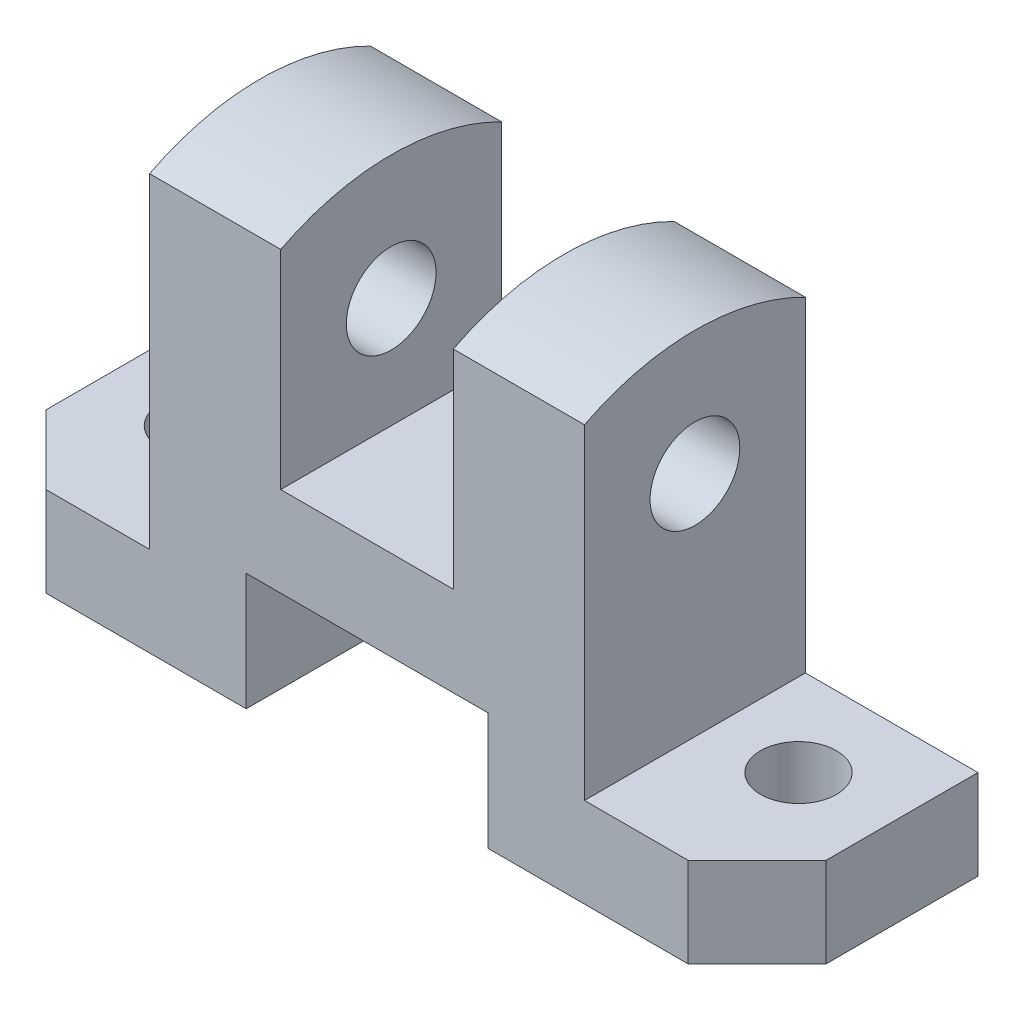
ISO-10303-21;
HEADER;
FILE_DESCRIPTION(('STEP AP214'),'2;1');
FILE_NAME('part.step','',(''),(''),'','','');
FILE_SCHEMA(('AUTOMOTIVE_DESIGN { 1 0 10303 214 1 1 1 1 }'));
ENDSEC;
DATA;
#1=APPLICATION_CONTEXT('core data for automotive mechanical design processes');
#2=APPLICATION_PROTOCOL_DEFINITION('international standard','automotive_design',2000,#1);
#3=PRODUCT_CONTEXT('',#1,'mechanical');
#4=PRODUCT('Part','Part','',(#3));
#5=PRODUCT_RELATED_PRODUCT_CATEGORY('part','',(#4));
#6=PRODUCT_DEFINITION_FORMATION('','',#4);
#7=PRODUCT_DEFINITION_CONTEXT('part definition',#1,'design');
#8=PRODUCT_DEFINITION('design','',#6,#7);
#9=PRODUCT_DEFINITION_SHAPE('','',#8);
#10=(LENGTH_UNIT() NAMED_UNIT(*) SI_UNIT(.MILLI.,.METRE.));
#11=(NAMED_UNIT(*) PLANE_ANGLE_UNIT() SI_UNIT($,.RADIAN.));
#12=(NAMED_UNIT(*) SI_UNIT($,.STERADIAN.) SOLID_ANGLE_UNIT());
#13=UNCERTAINTY_MEASURE_WITH_UNIT(LENGTH_MEASURE(1.E-05),#10,'distance_accuracy_value','');
#14=(GEOMETRIC_REPRESENTATION_CONTEXT(3) GLOBAL_UNCERTAINTY_ASSIGNED_CONTEXT((#13)) GLOBAL_UNIT_ASSIGNED_CONTEXT((#10,
#11,#12)) REPRESENTATION_CONTEXT('',''));
#15=CARTESIAN_POINT('',(0.,0.,0.));
#16=DIRECTION('',(0.,0.,1.));
#17=DIRECTION('',(1.,0.,0.));
#18=AXIS2_PLACEMENT_3D('',#15,#16,#17);
#19=CARTESIAN_POINT('',(-31.5,29.,16.));
#20=DIRECTION('',(1.,0.,0.));
#21=DIRECTION('',(0.,0.,-1.));
#22=AXIS2_PLACEMENT_3D('',#19,#20,#21);
#23=CYLINDRICAL_SURFACE('',#22,35.);
#24=CARTESIAN_POINT('',(-12.5,29.,16.));
#25=DIRECTION('',(-1.,0.,0.));
#26=DIRECTION('',(0.,-1.,0.));
#27=AXIS2_PLACEMENT_3D('',#24,#25,#26);
#28=CIRCLE('',#27,35.);
#29=CARTESIAN_POINT('',(-12.5,60.1287648325468,0.));
#30=VERTEX_POINT('',#29);
#31=CARTESIAN_POINT('',(-12.5,60.1287648325468,32.));
#32=VERTEX_POINT('',#31);
#33=EDGE_CURVE('E180',#30,#32,#28,.F.);
#34=ORIENTED_EDGE('',*,*,#33,.F.);
#35=DIRECTION('',(1.,0.,0.));
#36=VECTOR('',#35,1.);
#37=CARTESIAN_POINT('',(-31.5,60.1287648325468,0.));
#38=LINE('',#37,#36);
#39=CARTESIAN_POINT('',(-31.5,60.1287648325468,0.));
#40=VERTEX_POINT('',#39);
#41=EDGE_CURVE('E231',#40,#30,#38,.T.);
#42=ORIENTED_EDGE('',*,*,#41,.F.);
#43=CARTESIAN_POINT('',(-31.5,29.,16.));
#44=DIRECTION('',(1.,0.,0.));
#45=DIRECTION('',(0.,0.,-1.));
#46=AXIS2_PLACEMENT_3D('',#43,#44,#45);
#47=CIRCLE('',#46,35.);
#48=CARTESIAN_POINT('',(-31.5,60.1287648325468,32.));
#49=VERTEX_POINT('',#48);
#50=EDGE_CURVE('E221',#40,#49,#47,.T.);
#51=ORIENTED_EDGE('',*,*,#50,.T.);
#52=DIRECTION('',(1.,0.,0.));
#53=VECTOR('',#52,1.);
#54=CARTESIAN_POINT('',(-31.5,60.1287648325468,32.));
#55=LINE('',#54,#53);
#56=EDGE_CURVE('E226',#49,#32,#55,.T.);
#57=ORIENTED_EDGE('',*,*,#56,.T.);
#58=EDGE_LOOP('',(#34,#42,#51,#57));
#59=FACE_BOUND('',#58,.T.);
#60=ADVANCED_FACE('F39',(#59),#23,.T.);
#61=CARTESIAN_POINT('',(-31.5,46.,16.));
#62=DIRECTION('',(1.,0.,0.));
#63=DIRECTION('',(0.,0.,-1.));
#64=AXIS2_PLACEMENT_3D('',#61,#62,#63);
#65=CYLINDRICAL_SURFACE('',#64,6.5);
#66=CARTESIAN_POINT('',(-12.5,46.,16.));
#67=DIRECTION('',(-1.,0.,0.));
#68=DIRECTION('',(0.,-1.,0.));
#69=AXIS2_PLACEMENT_3D('',#66,#67,#68);
#70=CIRCLE('',#69,6.5);
#71=CARTESIAN_POINT('',(-12.5,39.5,16.));
#72=VERTEX_POINT('',#71);
#73=EDGE_CURVE('E203',#72,#72,#70,.F.);
#74=ORIENTED_EDGE('',*,*,#73,.T.);
#75=EDGE_LOOP('',(#74));
#76=FACE_BOUND('',#75,.T.);
#77=CARTESIAN_POINT('',(-31.5,46.,16.));
#78=DIRECTION('',(1.,0.,0.));
#79=DIRECTION('',(0.,0.,-1.));
#80=AXIS2_PLACEMENT_3D('',#77,#78,#79);
#81=CIRCLE('',#80,6.5);
#82=CARTESIAN_POINT('',(-31.5,46.,9.5));
#83=VERTEX_POINT('',#82);
#84=EDGE_CURVE('E217',#83,#83,#81,.T.);
#85=ORIENTED_EDGE('',*,*,#84,.F.);
#86=EDGE_LOOP('',(#85));
#87=FACE_BOUND('',#86,.T.);
#88=ADVANCED_FACE('F390',(#76,#87),#65,.F.);
#89=CARTESIAN_POINT('',(0.,13.,0.));
#90=DIRECTION('',(0.,-1.,0.));
#91=DIRECTION('',(0.,0.,-1.));
#92=AXIS2_PLACEMENT_3D('',#89,#90,#91);
#93=PLANE('',#92);
#94=CARTESIAN_POINT('',(43.5,13.,13.));
#95=DIRECTION('',(0.,1.,0.));
#96=DIRECTION('',(0.,0.,1.));
#97=AXIS2_PLACEMENT_3D('',#94,#95,#96);
#98=CIRCLE('',#97,5.5);
#99=CARTESIAN_POINT('',(43.5,13.,7.5));
#100=VERTEX_POINT('',#99);
#101=EDGE_CURVE('E330',#100,#100,#98,.T.);
#102=ORIENTED_EDGE('',*,*,#101,.F.);
#103=EDGE_LOOP('',(#102));
#104=FACE_BOUND('',#103,.T.);
#105=DIRECTION('',(0.,0.,-1.));
#106=VECTOR('',#105,1.);
#107=CARTESIAN_POINT('',(31.5,13.,32.));
#108=LINE('',#107,#106);
#109=CARTESIAN_POINT('',(31.5,13.,32.));
#110=VERTEX_POINT('',#109);
#111=CARTESIAN_POINT('',(31.5,13.,0.));
#112=VERTEX_POINT('',#111);
#113=EDGE_CURVE('E63',#110,#112,#108,.T.);
#114=ORIENTED_EDGE('',*,*,#113,.F.);
#115=DIRECTION('',(1.,0.,0.));
#116=VECTOR('',#115,1.);
#117=CARTESIAN_POINT('',(46.5,13.,32.));
#118=LINE('',#117,#116);
#119=CARTESIAN_POINT('',(46.5,13.,32.));
#120=VERTEX_POINT('',#119);
#121=EDGE_CURVE('E338',#110,#120,#118,.T.);
#122=ORIENTED_EDGE('',*,*,#121,.T.);
#123=DIRECTION('',(0.707106781186546,0.,-0.707106781186549));
#124=VECTOR('',#123,1.);
#125=CARTESIAN_POINT('',(56.5,13.,22.));
#126=LINE('',#125,#124);
#127=CARTESIAN_POINT('',(56.5,13.,22.));
#128=VERTEX_POINT('',#127);
#129=EDGE_CURVE('E341',#120,#128,#126,.T.);
#130=ORIENTED_EDGE('',*,*,#129,.T.);
#131=DIRECTION('',(0.,0.,-1.));
#132=VECTOR('',#131,1.);
#133=CARTESIAN_POINT('',(56.5,13.,0.));
#134=LINE('',#133,#132);
#135=CARTESIAN_POINT('',(56.5,13.,0.));
#136=VERTEX_POINT('',#135);
#137=EDGE_CURVE('E345',#128,#136,#134,.T.);
#138=ORIENTED_EDGE('',*,*,#137,.T.);
#139=DIRECTION('',(-1.,0.,0.));
#140=VECTOR('',#139,1.);
#141=CARTESIAN_POINT('',(17.5,13.,0.));
#142=LINE('',#141,#140);
#143=EDGE_CURVE('E348',#136,#112,#142,.T.);
#144=ORIENTED_EDGE('',*,*,#143,.T.);
#145=EDGE_LOOP('',(#114,#122,#130,#138,#144));
#146=FACE_BOUND('',#145,.T.);
#147=ADVANCED_FACE('F412',(#104,#146),#93,.F.);
#148=CARTESIAN_POINT('',(0.,0.,0.));
#149=DIRECTION('',(0.,-1.,0.));
#150=DIRECTION('',(0.,0.,-1.));
#151=AXIS2_PLACEMENT_3D('',#148,#149,#150);
#152=PLANE('',#151);
#153=DIRECTION('',(0.,0.,1.));
#154=VECTOR('',#153,1.);
#155=CARTESIAN_POINT('',(17.5,0.,0.));
#156=LINE('',#155,#154);
#157=CARTESIAN_POINT('',(17.5,0.,0.));
#158=VERTEX_POINT('',#157);
#159=CARTESIAN_POINT('',(17.5,0.,32.));
#160=VERTEX_POINT('',#159);
#161=EDGE_CURVE('E334',#158,#160,#156,.T.);
#162=ORIENTED_EDGE('',*,*,#161,.F.);
#163=DIRECTION('',(-1.,0.,0.));
#164=VECTOR('',#163,1.);
#165=CARTESIAN_POINT('',(17.5,0.,0.));
#166=LINE('',#165,#164);
#167=CARTESIAN_POINT('',(56.5,0.,0.));
#168=VERTEX_POINT('',#167);
#169=EDGE_CURVE('E342',#168,#158,#166,.T.);
#170=ORIENTED_EDGE('',*,*,#169,.F.);
#171=DIRECTION('',(0.,0.,-1.));
#172=VECTOR('',#171,1.);
#173=CARTESIAN_POINT('',(56.5,0.,0.));
#174=LINE('',#173,#172);
#175=CARTESIAN_POINT('',(56.5,0.,22.));
#176=VERTEX_POINT('',#175);
#177=EDGE_CURVE('E361',#176,#168,#174,.T.);
#178=ORIENTED_EDGE('',*,*,#177,.F.);
#179=DIRECTION('',(0.707106781186546,0.,-0.707106781186549));
#180=VECTOR('',#179,1.);
#181=CARTESIAN_POINT('',(56.5,0.,22.));
#182=LINE('',#181,#180);
#183=CARTESIAN_POINT('',(46.5,0.,32.));
#184=VERTEX_POINT('',#183);
#185=EDGE_CURVE('E358',#184,#176,#182,.T.);
#186=ORIENTED_EDGE('',*,*,#185,.F.);
#187=DIRECTION('',(1.,0.,0.));
#188=VECTOR('',#187,1.);
#189=CARTESIAN_POINT('',(46.5,0.,32.));
#190=LINE('',#189,#188);
#191=EDGE_CURVE('E355',#160,#184,#190,.T.);
#192=ORIENTED_EDGE('',*,*,#191,.F.);
#193=EDGE_LOOP('',(#162,#170,#178,#186,#192));
#194=FACE_BOUND('',#193,.T.);
#195=CARTESIAN_POINT('',(43.5,0.,13.));
#196=DIRECTION('',(0.,1.,0.));
#197=DIRECTION('',(0.,0.,1.));
#198=AXIS2_PLACEMENT_3D('',#195,#196,#197);
#199=CIRCLE('',#198,5.5);
#200=CARTESIAN_POINT('',(43.5,0.,7.5));
#201=VERTEX_POINT('',#200);
#202=EDGE_CURVE('E329',#201,#201,#199,.T.);
#203=ORIENTED_EDGE('',*,*,#202,.T.);
#204=EDGE_LOOP('',(#203));
#205=FACE_BOUND('',#204,.T.);
#206=ADVANCED_FACE('F448',(#194,#205),#152,.T.);
#207=CARTESIAN_POINT('',(17.5,13.,0.));
#208=DIRECTION('',(1.,0.,0.));
#209=DIRECTION('',(0.,0.,-1.));
#210=AXIS2_PLACEMENT_3D('',#207,#208,#209);
#211=PLANE('',#210);
#212=ORIENTED_EDGE('',*,*,#161,.T.);
#213=DIRECTION('',(0.,-1.,0.));
#214=VECTOR('',#213,1.);
#215=CARTESIAN_POINT('',(17.5,13.,32.));
#216=LINE('',#215,#214);
#217=CARTESIAN_POINT('',(17.5,17.,32.));
#218=VERTEX_POINT('',#217);
#219=EDGE_CURVE('E48',#218,#160,#216,.T.);
#220=ORIENTED_EDGE('',*,*,#219,.F.);
#221=DIRECTION('',(0.,0.,-1.));
#222=VECTOR('',#221,1.);
#223=CARTESIAN_POINT('',(17.5,17.,32.));
#224=LINE('',#223,#222);
#225=CARTESIAN_POINT('',(17.5,17.,0.));
#226=VERTEX_POINT('',#225);
#227=EDGE_CURVE('E321',#218,#226,#224,.T.);
#228=ORIENTED_EDGE('',*,*,#227,.T.);
#229=DIRECTION('',(0.,-1.,0.));
#230=VECTOR('',#229,1.);
#231=CARTESIAN_POINT('',(17.5,13.,0.));
#232=LINE('',#231,#230);
#233=EDGE_CURVE('E351',#226,#158,#232,.T.);
#234=ORIENTED_EDGE('',*,*,#233,.T.);
#235=EDGE_LOOP('',(#212,#220,#228,#234));
#236=FACE_BOUND('',#235,.T.);
#237=ADVANCED_FACE('F41',(#236),#211,.F.);
#238=CARTESIAN_POINT('',(46.5,13.,32.));
#239=DIRECTION('',(0.,0.,-1.));
#240=DIRECTION('',(-1.,0.,0.));
#241=AXIS2_PLACEMENT_3D('',#238,#239,#240);
#242=PLANE('',#241);
#243=DIRECTION('',(1.,0.,0.));
#244=VECTOR('',#243,1.);
#245=CARTESIAN_POINT('',(-12.5,30.,32.));
#246=LINE('',#245,#244);
#247=CARTESIAN_POINT('',(-12.5,30.,32.));
#248=VERTEX_POINT('',#247);
#249=CARTESIAN_POINT('',(12.5,30.,32.));
#250=VERTEX_POINT('',#249);
#251=EDGE_CURVE('E170',#248,#250,#246,.T.);
#252=ORIENTED_EDGE('',*,*,#251,.F.);
#253=DIRECTION('',(0.,-1.,0.));
#254=VECTOR('',#253,1.);
#255=CARTESIAN_POINT('',(-12.5,64.,32.));
#256=LINE('',#255,#254);
#257=EDGE_CURVE('E178',#32,#248,#256,.T.);
#258=ORIENTED_EDGE('',*,*,#257,.F.);
#259=ORIENTED_EDGE('',*,*,#56,.F.);
#260=DIRECTION('',(0.,-1.,0.));
#261=VECTOR('',#260,1.);
#262=CARTESIAN_POINT('',(-31.5,13.,32.));
#263=LINE('',#262,#261);
#264=CARTESIAN_POINT('',(-31.5,13.,32.));
#265=VERTEX_POINT('',#264);
#266=EDGE_CURVE('E298',#49,#265,#263,.T.);
#267=ORIENTED_EDGE('',*,*,#266,.T.);
#268=DIRECTION('',(1.,0.,0.));
#269=VECTOR('',#268,1.);
#270=CARTESIAN_POINT('',(-46.5,13.,32.));
#271=LINE('',#270,#269);
#272=CARTESIAN_POINT('',(-46.5,13.,32.));
#273=VERTEX_POINT('',#272);
#274=EDGE_CURVE('E253',#273,#265,#271,.T.);
#275=ORIENTED_EDGE('',*,*,#274,.F.);
#276=DIRECTION('',(0.,-1.,0.));
#277=VECTOR('',#276,1.);
#278=CARTESIAN_POINT('',(-46.5,13.,32.));
#279=LINE('',#278,#277);
#280=CARTESIAN_POINT('',(-46.5,0.,32.));
#281=VERTEX_POINT('',#280);
#282=EDGE_CURVE('E256',#273,#281,#279,.T.);
#283=ORIENTED_EDGE('',*,*,#282,.T.);
#284=DIRECTION('',(1.,0.,0.));
#285=VECTOR('',#284,1.);
#286=CARTESIAN_POINT('',(-46.5,0.,32.));
#287=LINE('',#286,#285);
#288=CARTESIAN_POINT('',(-17.5,0.,32.));
#289=VERTEX_POINT('',#288);
#290=EDGE_CURVE('E266',#281,#289,#287,.T.);
#291=ORIENTED_EDGE('',*,*,#290,.T.);
#292=DIRECTION('',(0.,1.,0.));
#293=VECTOR('',#292,1.);
#294=CARTESIAN_POINT('',(-17.5,17.,32.));
#295=LINE('',#294,#293);
#296=CARTESIAN_POINT('',(-17.5,17.,32.));
#297=VERTEX_POINT('',#296);
#298=EDGE_CURVE('E285',#289,#297,#295,.T.);
#299=ORIENTED_EDGE('',*,*,#298,.T.);
#300=DIRECTION('',(1.,0.,0.));
#301=VECTOR('',#300,1.);
#302=CARTESIAN_POINT('',(-12.5,17.,32.));
#303=LINE('',#302,#301);
#304=EDGE_CURVE('E289',#297,#218,#303,.T.);
#305=ORIENTED_EDGE('',*,*,#304,.T.);
#306=ORIENTED_EDGE('',*,*,#219,.T.);
#307=ORIENTED_EDGE('',*,*,#191,.T.);
#308=DIRECTION('',(0.,-1.,0.));
#309=VECTOR('',#308,1.);
#310=CARTESIAN_POINT('',(46.5,13.,32.));
#311=LINE('',#310,#309);
#312=EDGE_CURVE('E377',#120,#184,#311,.T.);
#313=ORIENTED_EDGE('',*,*,#312,.F.);
#314=ORIENTED_EDGE('',*,*,#121,.F.);
#315=DIRECTION('',(0.,1.,0.));
#316=VECTOR('',#315,1.);
#317=CARTESIAN_POINT('',(31.5,13.,32.));
#318=LINE('',#317,#316);
#319=CARTESIAN_POINT('',(31.5,60.1287648325468,32.));
#320=VERTEX_POINT('',#319);
#321=EDGE_CURVE('E294',#110,#320,#318,.T.);
#322=ORIENTED_EDGE('',*,*,#321,.T.);
#323=CARTESIAN_POINT('',(12.5,60.1287648325468,32.));
#324=VERTEX_POINT('',#323);
#325=EDGE_CURVE('E230',#324,#320,#55,.T.);
#326=ORIENTED_EDGE('',*,*,#325,.F.);
#327=DIRECTION('',(0.,1.,0.));
#328=VECTOR('',#327,1.);
#329=CARTESIAN_POINT('',(12.5,30.,32.));
#330=LINE('',#329,#328);
#331=EDGE_CURVE('E55',#250,#324,#330,.T.);
#332=ORIENTED_EDGE('',*,*,#331,.F.);
#333=EDGE_LOOP('',(#252,#258,#259,#267,#275,#283,#291,#299,#305,#306,#307,#313,#314,#322,#326,#332));
#334=FACE_BOUND('',#333,.T.);
#335=ADVANCED_FACE('F186',(#334),#242,.F.);
#336=CARTESIAN_POINT('',(56.5,13.,22.));
#337=DIRECTION('',(-0.707106781186549,0.,-0.707106781186546));
#338=DIRECTION('',(-0.707106781186546,0.,0.707106781186549));
#339=AXIS2_PLACEMENT_3D('',#336,#337,#338);
#340=PLANE('',#339);
#341=ORIENTED_EDGE('',*,*,#185,.T.);
#342=DIRECTION('',(0.,-1.,0.));
#343=VECTOR('',#342,1.);
#344=CARTESIAN_POINT('',(56.5,13.,22.));
#345=LINE('',#344,#343);
#346=EDGE_CURVE('E373',#128,#176,#345,.T.);
#347=ORIENTED_EDGE('',*,*,#346,.F.);
#348=ORIENTED_EDGE('',*,*,#129,.F.);
#349=ORIENTED_EDGE('',*,*,#312,.T.);
#350=EDGE_LOOP('',(#341,#347,#348,#349));
#351=FACE_BOUND('',#350,.T.);
#352=ADVANCED_FACE('F512',(#351),#340,.F.);
#353=CARTESIAN_POINT('',(56.5,13.,0.));
#354=DIRECTION('',(-1.,0.,0.));
#355=DIRECTION('',(0.,0.,1.));
#356=AXIS2_PLACEMENT_3D('',#353,#354,#355);
#357=PLANE('',#356);
#358=ORIENTED_EDGE('',*,*,#177,.T.);
#359=DIRECTION('',(0.,-1.,0.));
#360=VECTOR('',#359,1.);
#361=CARTESIAN_POINT('',(56.5,13.,0.));
#362=LINE('',#361,#360);
#363=EDGE_CURVE('E369',#136,#168,#362,.T.);
#364=ORIENTED_EDGE('',*,*,#363,.F.);
#365=ORIENTED_EDGE('',*,*,#137,.F.);
#366=ORIENTED_EDGE('',*,*,#346,.T.);
#367=EDGE_LOOP('',(#358,#364,#365,#366));
#368=FACE_BOUND('',#367,.T.);
#369=ADVANCED_FACE('F443',(#368),#357,.F.);
#370=CARTESIAN_POINT('',(17.5,13.,0.));
#371=DIRECTION('',(0.,0.,1.));
#372=DIRECTION('',(1.,0.,0.));
#373=AXIS2_PLACEMENT_3D('',#370,#371,#372);
#374=PLANE('',#373);
#375=ORIENTED_EDGE('',*,*,#41,.T.);
#376=DIRECTION('',(0.,-1.,0.));
#377=VECTOR('',#376,1.);
#378=CARTESIAN_POINT('',(-12.5,13.,0.));
#379=LINE('',#378,#377);
#380=CARTESIAN_POINT('',(-12.5,30.,0.));
#381=VERTEX_POINT('',#380);
#382=EDGE_CURVE('E206',#30,#381,#379,.T.);
#383=ORIENTED_EDGE('',*,*,#382,.T.);
#384=DIRECTION('',(1.,0.,0.));
#385=VECTOR('',#384,1.);
#386=CARTESIAN_POINT('',(17.5,30.,0.));
#387=LINE('',#386,#385);
#388=CARTESIAN_POINT('',(12.5,30.,0.));
#389=VERTEX_POINT('',#388);
#390=EDGE_CURVE('E11',#381,#389,#387,.T.);
#391=ORIENTED_EDGE('',*,*,#390,.T.);
#392=DIRECTION('',(0.,1.,0.));
#393=VECTOR('',#392,1.);
#394=CARTESIAN_POINT('',(12.5,13.,0.));
#395=LINE('',#394,#393);
#396=CARTESIAN_POINT('',(12.5,60.1287648325468,0.));
#397=VERTEX_POINT('',#396);
#398=EDGE_CURVE('E199',#389,#397,#395,.T.);
#399=ORIENTED_EDGE('',*,*,#398,.T.);
#400=CARTESIAN_POINT('',(31.5,60.1287648325468,0.));
#401=VERTEX_POINT('',#400);
#402=EDGE_CURVE('E225',#397,#401,#38,.T.);
#403=ORIENTED_EDGE('',*,*,#402,.T.);
#404=DIRECTION('',(0.,1.,0.));
#405=VECTOR('',#404,1.);
#406=CARTESIAN_POINT('',(31.5,13.,0.));
#407=LINE('',#406,#405);
#408=EDGE_CURVE('E310',#112,#401,#407,.T.);
#409=ORIENTED_EDGE('',*,*,#408,.F.);
#410=ORIENTED_EDGE('',*,*,#143,.F.);
#411=ORIENTED_EDGE('',*,*,#363,.T.);
#412=ORIENTED_EDGE('',*,*,#169,.T.);
#413=ORIENTED_EDGE('',*,*,#233,.F.);
#414=DIRECTION('',(1.,0.,0.));
#415=VECTOR('',#414,1.);
#416=CARTESIAN_POINT('',(12.5,17.,0.));
#417=LINE('',#416,#415);
#418=CARTESIAN_POINT('',(-17.5,17.,0.));
#419=VERTEX_POINT('',#418);
#420=EDGE_CURVE('E306',#419,#226,#417,.T.);
#421=ORIENTED_EDGE('',*,*,#420,.F.);
#422=DIRECTION('',(0.,1.,0.));
#423=VECTOR('',#422,1.);
#424=CARTESIAN_POINT('',(-17.5,17.,0.));
#425=LINE('',#424,#423);
#426=CARTESIAN_POINT('',(-17.5,0.,0.));
#427=VERTEX_POINT('',#426);
#428=EDGE_CURVE('E284',#427,#419,#425,.T.);
#429=ORIENTED_EDGE('',*,*,#428,.F.);
#430=DIRECTION('',(-1.,0.,0.));
#431=VECTOR('',#430,1.);
#432=CARTESIAN_POINT('',(-17.5,0.,0.));
#433=LINE('',#432,#431);
#434=CARTESIAN_POINT('',(-56.5,0.,0.));
#435=VERTEX_POINT('',#434);
#436=EDGE_CURVE('E239',#427,#435,#433,.T.);
#437=ORIENTED_EDGE('',*,*,#436,.T.);
#438=DIRECTION('',(0.,-1.,0.));
#439=VECTOR('',#438,1.);
#440=CARTESIAN_POINT('',(-56.5,13.,0.));
#441=LINE('',#440,#439);
#442=CARTESIAN_POINT('',(-56.5,13.,0.));
#443=VERTEX_POINT('',#442);
#444=EDGE_CURVE('E280',#443,#435,#441,.T.);
#445=ORIENTED_EDGE('',*,*,#444,.F.);
#446=DIRECTION('',(-1.,0.,0.));
#447=VECTOR('',#446,1.);
#448=CARTESIAN_POINT('',(-17.5,13.,0.));
#449=LINE('',#448,#447);
#450=CARTESIAN_POINT('',(-31.5,13.,0.));
#451=VERTEX_POINT('',#450);
#452=EDGE_CURVE('E243',#451,#443,#449,.T.);
#453=ORIENTED_EDGE('',*,*,#452,.F.);
#454=DIRECTION('',(0.,-1.,0.));
#455=VECTOR('',#454,1.);
#456=CARTESIAN_POINT('',(-31.5,13.,0.));
#457=LINE('',#456,#455);
#458=EDGE_CURVE('E290',#40,#451,#457,.T.);
#459=ORIENTED_EDGE('',*,*,#458,.F.);
#460=EDGE_LOOP('',(#375,#383,#391,#399,#403,#409,#410,#411,#412,#413,#421,#429,#437,#445,#453,#459));
#461=FACE_BOUND('',#460,.T.);
#462=ADVANCED_FACE('F436',(#461),#374,.F.);
#463=CARTESIAN_POINT('',(43.5,13.,13.));
#464=DIRECTION('',(0.,-1.,0.));
#465=DIRECTION('',(0.,0.,-1.));
#466=AXIS2_PLACEMENT_3D('',#463,#464,#465);
#467=CYLINDRICAL_SURFACE('',#466,5.5);
#468=CARTESIAN_POINT('',(43.5,13.,7.5));
#469=CARTESIAN_POINT('',(43.5,12.8645833333333,7.5));
#470=CARTESIAN_POINT('',(43.5,12.7291666666667,7.5));
#471=CARTESIAN_POINT('',(43.5,12.4583333333333,7.5));
#472=CARTESIAN_POINT('',(43.5,12.3229166666667,7.5));
#473=CARTESIAN_POINT('',(43.5,12.0520833333333,7.5));
#474=CARTESIAN_POINT('',(43.5,11.9166666666667,7.5));
#475=CARTESIAN_POINT('',(43.5,11.6458333333333,7.5));
#476=CARTESIAN_POINT('',(43.5,11.5104166666667,7.5));
#477=CARTESIAN_POINT('',(43.5,11.2395833333333,7.5));
#478=CARTESIAN_POINT('',(43.5,11.1041666666667,7.5));
#479=CARTESIAN_POINT('',(43.5,10.8333333333333,7.5));
#480=CARTESIAN_POINT('',(43.5,10.6979166666667,7.5));
#481=CARTESIAN_POINT('',(43.5,10.4270833333333,7.5));
#482=CARTESIAN_POINT('',(43.5,10.2916666666667,7.5));
#483=CARTESIAN_POINT('',(43.5,10.0208333333333,7.5));
#484=CARTESIAN_POINT('',(43.5,9.88541666666667,7.5));
#485=CARTESIAN_POINT('',(43.5,9.61458333333333,7.5));
#486=CARTESIAN_POINT('',(43.5,9.47916666666667,7.5));
#487=CARTESIAN_POINT('',(43.5,9.20833333333333,7.5));
#488=CARTESIAN_POINT('',(43.5,9.07291666666666,7.5));
#489=CARTESIAN_POINT('',(43.5,8.80208333333333,7.5));
#490=CARTESIAN_POINT('',(43.5,8.66666666666667,7.5));
#491=CARTESIAN_POINT('',(43.5,8.39583333333333,7.5));
#492=CARTESIAN_POINT('',(43.5,8.26041666666667,7.5));
#493=CARTESIAN_POINT('',(43.5,7.98958333333333,7.5));
#494=CARTESIAN_POINT('',(43.5,7.85416666666667,7.5));
#495=CARTESIAN_POINT('',(43.5,7.58333333333333,7.5));
#496=CARTESIAN_POINT('',(43.5,7.44791666666667,7.5));
#497=CARTESIAN_POINT('',(43.5,7.17708333333333,7.5));
#498=CARTESIAN_POINT('',(43.5,7.04166666666667,7.5));
#499=CARTESIAN_POINT('',(43.5,6.77083333333333,7.5));
#500=CARTESIAN_POINT('',(43.5,6.63541666666667,7.5));
#501=CARTESIAN_POINT('',(43.5,6.36458333333333,7.5));
#502=CARTESIAN_POINT('',(43.5,6.22916666666667,7.5));
#503=CARTESIAN_POINT('',(43.5,5.95833333333333,7.5));
#504=CARTESIAN_POINT('',(43.5,5.82291666666667,7.5));
#505=CARTESIAN_POINT('',(43.5,5.55208333333333,7.5));
#506=CARTESIAN_POINT('',(43.5,5.41666666666667,7.5));
#507=CARTESIAN_POINT('',(43.5,5.14583333333333,7.5));
#508=CARTESIAN_POINT('',(43.5,5.01041666666667,7.5));
#509=CARTESIAN_POINT('',(43.5,4.73958333333333,7.5));
#510=CARTESIAN_POINT('',(43.5,4.60416666666667,7.5));
#511=CARTESIAN_POINT('',(43.5,4.33333333333333,7.5));
#512=CARTESIAN_POINT('',(43.5,4.19791666666667,7.5));
#513=CARTESIAN_POINT('',(43.5,3.92708333333333,7.5));
#514=CARTESIAN_POINT('',(43.5,3.79166666666667,7.5));
#515=CARTESIAN_POINT('',(43.5,3.52083333333333,7.5));
#516=CARTESIAN_POINT('',(43.5,3.38541666666667,7.5));
#517=CARTESIAN_POINT('',(43.5,3.11458333333333,7.5));
#518=CARTESIAN_POINT('',(43.5,2.97916666666667,7.5));
#519=CARTESIAN_POINT('',(43.5,2.70833333333333,7.5));
#520=CARTESIAN_POINT('',(43.5,2.57291666666667,7.5));
#521=CARTESIAN_POINT('',(43.5,2.30208333333333,7.5));
#522=CARTESIAN_POINT('',(43.5,2.16666666666667,7.5));
#523=CARTESIAN_POINT('',(43.5,1.89583333333333,7.5));
#524=CARTESIAN_POINT('',(43.5,1.76041666666667,7.5));
#525=CARTESIAN_POINT('',(43.5,1.48958333333333,7.5));
#526=CARTESIAN_POINT('',(43.5,1.35416666666667,7.5));
#527=CARTESIAN_POINT('',(43.5,1.08333333333333,7.5));
#528=CARTESIAN_POINT('',(43.5,0.947916666666667,7.5));
#529=CARTESIAN_POINT('',(43.5,0.677083333333334,7.5));
#530=CARTESIAN_POINT('',(43.5,0.541666666666667,7.5));
#531=CARTESIAN_POINT('',(43.5,0.270833333333334,7.5));
#532=CARTESIAN_POINT('',(43.5,0.135416666666667,7.5));
#533=CARTESIAN_POINT('',(43.5,0.,7.5));
#534=B_SPLINE_CURVE_WITH_KNOTS('',3,(#468,#469,#470,#471,#472,#473,#474,#475,#476,#477,#478,
#479,#480,#481,#482,#483,#484,#485,#486,#487,#488,#489,#490,#491,#492,#493,#494,#495,#496,#497,
#498,#499,#500,#501,#502,#503,#504,#505,#506,#507,#508,#509,#510,#511,#512,#513,#514,#515,#516,
#517,#518,#519,#520,#521,#522,#523,#524,#525,#526,#527,#528,#529,#530,#531,#532,#533),
.UNSPECIFIED.,.F.,.F.,(4,2,2,2,2,2,2,2,2,2,2,2,2,2,2,2,2,2,2,2,2,2,2,2,2,2,2,2,2,2,2,2,4),(0.,
0.40625,0.812500000000001,1.21875,1.625,2.03125,2.4375,2.84375,3.25,3.65625,4.0625,4.46875,
4.875,5.28125,5.6875,6.09375,6.5,6.90625,7.3125,7.71875,8.125,8.53125,8.9375,9.34375,9.75,
10.15625,10.5625,10.96875,11.375,11.78125,12.1875,12.59375,13.),.UNSPECIFIED.);
#535=EDGE_CURVE('BSEAM499',#100,#201,#534,.T.);
#536=ORIENTED_EDGE('',*,*,#101,.T.);
#537=ORIENTED_EDGE('',*,*,#202,.F.);
#538=ORIENTED_EDGE('',*,*,#535,.T.);
#539=ORIENTED_EDGE('',*,*,#535,.F.);
#540=EDGE_LOOP('',(#536,#538,#537,#539));
#541=FACE_BOUND('',#540,.T.);
#542=ADVANCED_FACE('F499',(#541),#467,.F.);
#543=CARTESIAN_POINT('',(-17.5,17.,32.));
#544=DIRECTION('',(-1.,0.,0.));
#545=DIRECTION('',(0.,-1.,0.));
#546=AXIS2_PLACEMENT_3D('',#543,#544,#545);
#547=PLANE('',#546);
#548=ORIENTED_EDGE('',*,*,#428,.T.);
#549=DIRECTION('',(0.,0.,-1.));
#550=VECTOR('',#549,1.);
#551=CARTESIAN_POINT('',(-17.5,17.,32.));
#552=LINE('',#551,#550);
#553=EDGE_CURVE('E325',#297,#419,#552,.T.);
#554=ORIENTED_EDGE('',*,*,#553,.F.);
#555=ORIENTED_EDGE('',*,*,#298,.F.);
#556=DIRECTION('',(0.,0.,-1.));
#557=VECTOR('',#556,1.);
#558=CARTESIAN_POINT('',(-17.5,0.,0.));
#559=LINE('',#558,#557);
#560=EDGE_CURVE('E247',#289,#427,#559,.T.);
#561=ORIENTED_EDGE('',*,*,#560,.T.);
#562=EDGE_LOOP('',(#548,#554,#555,#561));
#563=FACE_BOUND('',#562,.T.);
#564=ADVANCED_FACE('F459',(#563),#547,.F.);
#565=CARTESIAN_POINT('',(12.5,17.,32.));
#566=DIRECTION('',(0.,1.,0.));
#567=DIRECTION('',(0.,0.,1.));
#568=AXIS2_PLACEMENT_3D('',#565,#566,#567);
#569=PLANE('',#568);
#570=ORIENTED_EDGE('',*,*,#420,.T.);
#571=ORIENTED_EDGE('',*,*,#227,.F.);
#572=ORIENTED_EDGE('',*,*,#304,.F.);
#573=ORIENTED_EDGE('',*,*,#553,.T.);
#574=EDGE_LOOP('',(#570,#571,#572,#573));
#575=FACE_BOUND('',#574,.T.);
#576=ADVANCED_FACE('F453',(#575),#569,.F.);
#577=CARTESIAN_POINT('',(31.5,13.,32.));
#578=DIRECTION('',(-1.,0.,0.));
#579=DIRECTION('',(0.,-1.,0.));
#580=AXIS2_PLACEMENT_3D('',#577,#578,#579);
#581=PLANE('',#580);
#582=ORIENTED_EDGE('',*,*,#408,.T.);
#583=CARTESIAN_POINT('',(31.5,29.,16.));
#584=DIRECTION('',(1.,0.,0.));
#585=DIRECTION('',(0.,0.,-1.));
#586=AXIS2_PLACEMENT_3D('',#583,#584,#585);
#587=CIRCLE('',#586,35.);
#588=EDGE_CURVE('E213',#401,#320,#587,.T.);
#589=ORIENTED_EDGE('',*,*,#588,.T.);
#590=ORIENTED_EDGE('',*,*,#321,.F.);
#591=ORIENTED_EDGE('',*,*,#113,.T.);
#592=EDGE_LOOP('',(#582,#589,#590,#591));
#593=FACE_BOUND('',#592,.T.);
#594=CARTESIAN_POINT('',(31.5,46.,16.));
#595=DIRECTION('',(1.,0.,0.));
#596=DIRECTION('',(0.,0.,-1.));
#597=AXIS2_PLACEMENT_3D('',#594,#595,#596);
#598=CIRCLE('',#597,6.5);
#599=CARTESIAN_POINT('',(31.5,46.,9.5));
#600=VERTEX_POINT('',#599);
#601=EDGE_CURVE('E209',#600,#600,#598,.T.);
#602=ORIENTED_EDGE('',*,*,#601,.F.);
#603=EDGE_LOOP('',(#602));
#604=FACE_BOUND('',#603,.T.);
#605=ADVANCED_FACE('F433',(#593,#604),#581,.F.);
#606=CARTESIAN_POINT('',(-31.5,13.,32.));
#607=DIRECTION('',(1.,0.,0.));
#608=DIRECTION('',(0.,1.,0.));
#609=AXIS2_PLACEMENT_3D('',#606,#607,#608);
#610=PLANE('',#609);
#611=ORIENTED_EDGE('',*,*,#458,.T.);
#612=DIRECTION('',(0.,0.,-1.));
#613=VECTOR('',#612,1.);
#614=CARTESIAN_POINT('',(-31.5,13.,32.));
#615=LINE('',#614,#613);
#616=EDGE_CURVE('E302',#265,#451,#615,.T.);
#617=ORIENTED_EDGE('',*,*,#616,.F.);
#618=ORIENTED_EDGE('',*,*,#266,.F.);
#619=ORIENTED_EDGE('',*,*,#50,.F.);
#620=EDGE_LOOP('',(#611,#617,#618,#619));
#621=FACE_BOUND('',#620,.T.);
#622=ORIENTED_EDGE('',*,*,#84,.T.);
#623=EDGE_LOOP('',(#622));
#624=FACE_BOUND('',#623,.T.);
#625=ADVANCED_FACE('F475',(#621,#624),#610,.F.);
#626=CARTESIAN_POINT('',(0.,13.,0.));
#627=DIRECTION('',(0.,1.,0.));
#628=DIRECTION('',(0.,0.,1.));
#629=AXIS2_PLACEMENT_3D('',#626,#627,#628);
#630=PLANE('',#629);
#631=CARTESIAN_POINT('',(-43.5,13.,13.));
#632=DIRECTION('',(0.,1.,0.));
#633=DIRECTION('',(0.,0.,-1.));
#634=AXIS2_PLACEMENT_3D('',#631,#632,#633);
#635=CIRCLE('',#634,5.5);
#636=CARTESIAN_POINT('',(-43.5,13.,7.50000000000001));
#637=VERTEX_POINT('',#636);
#638=EDGE_CURVE('E235',#637,#637,#635,.T.);
#639=ORIENTED_EDGE('',*,*,#638,.F.);
#640=EDGE_LOOP('',(#639));
#641=FACE_BOUND('',#640,.T.);
#642=ORIENTED_EDGE('',*,*,#616,.T.);
#643=ORIENTED_EDGE('',*,*,#452,.T.);
#644=DIRECTION('',(0.,0.,1.));
#645=VECTOR('',#644,1.);
#646=CARTESIAN_POINT('',(-56.5,13.,0.));
#647=LINE('',#646,#645);
#648=CARTESIAN_POINT('',(-56.5,13.,22.));
#649=VERTEX_POINT('',#648);
#650=EDGE_CURVE('E246',#443,#649,#647,.T.);
#651=ORIENTED_EDGE('',*,*,#650,.T.);
#652=DIRECTION('',(0.707106781186546,0.,0.707106781186549));
#653=VECTOR('',#652,1.);
#654=CARTESIAN_POINT('',(-56.5,13.,22.));
#655=LINE('',#654,#653);
#656=EDGE_CURVE('E250',#649,#273,#655,.T.);
#657=ORIENTED_EDGE('',*,*,#656,.T.);
#658=ORIENTED_EDGE('',*,*,#274,.T.);
#659=EDGE_LOOP('',(#642,#643,#651,#657,#658));
#660=FACE_BOUND('',#659,.T.);
#661=ADVANCED_FACE('F479',(#641,#660),#630,.T.);
#662=CARTESIAN_POINT('',(0.,0.,0.));
#663=DIRECTION('',(0.,1.,0.));
#664=DIRECTION('',(0.,0.,1.));
#665=AXIS2_PLACEMENT_3D('',#662,#663,#664);
#666=PLANE('',#665);
#667=ORIENTED_EDGE('',*,*,#436,.F.);
#668=ORIENTED_EDGE('',*,*,#560,.F.);
#669=ORIENTED_EDGE('',*,*,#290,.F.);
#670=DIRECTION('',(0.707106781186546,0.,0.707106781186549));
#671=VECTOR('',#670,1.);
#672=CARTESIAN_POINT('',(-56.5,0.,22.));
#673=LINE('',#672,#671);
#674=CARTESIAN_POINT('',(-56.5,0.,22.));
#675=VERTEX_POINT('',#674);
#676=EDGE_CURVE('E263',#675,#281,#673,.T.);
#677=ORIENTED_EDGE('',*,*,#676,.F.);
#678=DIRECTION('',(0.,0.,1.));
#679=VECTOR('',#678,1.);
#680=CARTESIAN_POINT('',(-56.5,0.,0.));
#681=LINE('',#680,#679);
#682=EDGE_CURVE('E260',#435,#675,#681,.T.);
#683=ORIENTED_EDGE('',*,*,#682,.F.);
#684=EDGE_LOOP('',(#667,#668,#669,#677,#683));
#685=FACE_BOUND('',#684,.T.);
#686=CARTESIAN_POINT('',(-43.5,0.,13.));
#687=DIRECTION('',(0.,1.,0.));
#688=DIRECTION('',(0.,0.,-1.));
#689=AXIS2_PLACEMENT_3D('',#686,#687,#688);
#690=CIRCLE('',#689,5.5);
#691=CARTESIAN_POINT('',(-43.5,0.,7.50000000000001));
#692=VERTEX_POINT('',#691);
#693=EDGE_CURVE('E229',#692,#692,#690,.T.);
#694=ORIENTED_EDGE('',*,*,#693,.T.);
#695=EDGE_LOOP('',(#694));
#696=FACE_BOUND('',#695,.T.);
#697=ADVANCED_FACE('F462',(#685,#696),#666,.F.);
#698=CARTESIAN_POINT('',(-56.5,13.,0.));
#699=DIRECTION('',(1.,0.,0.));
#700=DIRECTION('',(0.,0.,-1.));
#701=AXIS2_PLACEMENT_3D('',#698,#699,#700);
#702=PLANE('',#701);
#703=ORIENTED_EDGE('',*,*,#682,.T.);
#704=DIRECTION('',(0.,-1.,0.));
#705=VECTOR('',#704,1.);
#706=CARTESIAN_POINT('',(-56.5,13.,22.));
#707=LINE('',#706,#705);
#708=EDGE_CURVE('E276',#649,#675,#707,.T.);
#709=ORIENTED_EDGE('',*,*,#708,.F.);
#710=ORIENTED_EDGE('',*,*,#650,.F.);
#711=ORIENTED_EDGE('',*,*,#444,.T.);
#712=EDGE_LOOP('',(#703,#709,#710,#711));
#713=FACE_BOUND('',#712,.T.);
#714=ADVANCED_FACE('F468',(#713),#702,.F.);
#715=CARTESIAN_POINT('',(-56.5,13.,22.));
#716=DIRECTION('',(0.707106781186549,0.,-0.707106781186546));
#717=DIRECTION('',(-0.707106781186546,0.,-0.707106781186549));
#718=AXIS2_PLACEMENT_3D('',#715,#716,#717);
#719=PLANE('',#718);
#720=ORIENTED_EDGE('',*,*,#676,.T.);
#721=ORIENTED_EDGE('',*,*,#282,.F.);
#722=ORIENTED_EDGE('',*,*,#656,.F.);
#723=ORIENTED_EDGE('',*,*,#708,.T.);
#724=EDGE_LOOP('',(#720,#721,#722,#723));
#725=FACE_BOUND('',#724,.T.);
#726=ADVANCED_FACE('F422',(#725),#719,.F.);
#727=CARTESIAN_POINT('',(-43.5,13.,13.));
#728=DIRECTION('',(0.,-1.,0.));
#729=DIRECTION('',(0.,0.,-1.));
#730=AXIS2_PLACEMENT_3D('',#727,#728,#729);
#731=CYLINDRICAL_SURFACE('',#730,5.5);
#732=CARTESIAN_POINT('',(-43.5,13.,7.50000000000001));
#733=CARTESIAN_POINT('',(-43.5,12.8645833333333,7.50000000000001));
#734=CARTESIAN_POINT('',(-43.5,12.7291666666667,7.50000000000001));
#735=CARTESIAN_POINT('',(-43.5,12.4583333333333,7.50000000000001));
#736=CARTESIAN_POINT('',(-43.5,12.3229166666667,7.50000000000001));
#737=CARTESIAN_POINT('',(-43.5,12.0520833333333,7.50000000000001));
#738=CARTESIAN_POINT('',(-43.5,11.9166666666667,7.50000000000001));
#739=CARTESIAN_POINT('',(-43.5,11.6458333333333,7.50000000000001));
#740=CARTESIAN_POINT('',(-43.5,11.5104166666667,7.50000000000001));
#741=CARTESIAN_POINT('',(-43.5,11.2395833333333,7.50000000000001));
#742=CARTESIAN_POINT('',(-43.5,11.1041666666667,7.50000000000001));
#743=CARTESIAN_POINT('',(-43.5,10.8333333333333,7.50000000000001));
#744=CARTESIAN_POINT('',(-43.5,10.6979166666667,7.50000000000001));
#745=CARTESIAN_POINT('',(-43.5,10.4270833333333,7.50000000000001));
#746=CARTESIAN_POINT('',(-43.5,10.2916666666667,7.50000000000001));
#747=CARTESIAN_POINT('',(-43.5,10.0208333333333,7.50000000000001));
#748=CARTESIAN_POINT('',(-43.5,9.88541666666667,7.50000000000001));
#749=CARTESIAN_POINT('',(-43.5,9.61458333333333,7.50000000000001));
#750=CARTESIAN_POINT('',(-43.5,9.47916666666667,7.50000000000001));
#751=CARTESIAN_POINT('',(-43.5,9.20833333333333,7.50000000000001));
#752=CARTESIAN_POINT('',(-43.5,9.07291666666666,7.50000000000001));
#753=CARTESIAN_POINT('',(-43.5,8.80208333333333,7.50000000000001));
#754=CARTESIAN_POINT('',(-43.5,8.66666666666667,7.50000000000001));
#755=CARTESIAN_POINT('',(-43.5,8.39583333333333,7.50000000000001));
#756=CARTESIAN_POINT('',(-43.5,8.26041666666667,7.50000000000001));
#757=CARTESIAN_POINT('',(-43.5,7.98958333333333,7.50000000000001));
#758=CARTESIAN_POINT('',(-43.5,7.85416666666667,7.50000000000001));
#759=CARTESIAN_POINT('',(-43.5,7.58333333333333,7.50000000000001));
#760=CARTESIAN_POINT('',(-43.5,7.44791666666667,7.50000000000001));
#761=CARTESIAN_POINT('',(-43.5,7.17708333333333,7.50000000000001));
#762=CARTESIAN_POINT('',(-43.5,7.04166666666667,7.50000000000001));
#763=CARTESIAN_POINT('',(-43.5,6.77083333333333,7.50000000000001));
#764=CARTESIAN_POINT('',(-43.5,6.63541666666667,7.50000000000001));
#765=CARTESIAN_POINT('',(-43.5,6.36458333333333,7.50000000000001));
#766=CARTESIAN_POINT('',(-43.5,6.22916666666667,7.50000000000001));
#767=CARTESIAN_POINT('',(-43.5,5.95833333333333,7.50000000000001));
#768=CARTESIAN_POINT('',(-43.5,5.82291666666667,7.50000000000001));
#769=CARTESIAN_POINT('',(-43.5,5.55208333333333,7.50000000000001));
#770=CARTESIAN_POINT('',(-43.5,5.41666666666667,7.50000000000001));
#771=CARTESIAN_POINT('',(-43.5,5.14583333333333,7.50000000000001));
#772=CARTESIAN_POINT('',(-43.5,5.01041666666667,7.50000000000001));
#773=CARTESIAN_POINT('',(-43.5,4.73958333333333,7.50000000000001));
#774=CARTESIAN_POINT('',(-43.5,4.60416666666667,7.50000000000001));
#775=CARTESIAN_POINT('',(-43.5,4.33333333333333,7.50000000000001));
#776=CARTESIAN_POINT('',(-43.5,4.19791666666667,7.50000000000001));
#777=CARTESIAN_POINT('',(-43.5,3.92708333333333,7.50000000000001));
#778=CARTESIAN_POINT('',(-43.5,3.79166666666667,7.50000000000001));
#779=CARTESIAN_POINT('',(-43.5,3.52083333333333,7.50000000000001));
#780=CARTESIAN_POINT('',(-43.5,3.38541666666667,7.50000000000001));
#781=CARTESIAN_POINT('',(-43.5,3.11458333333333,7.50000000000001));
#782=CARTESIAN_POINT('',(-43.5,2.97916666666667,7.50000000000001));
#783=CARTESIAN_POINT('',(-43.5,2.70833333333333,7.50000000000001));
#784=CARTESIAN_POINT('',(-43.5,2.57291666666667,7.50000000000001));
#785=CARTESIAN_POINT('',(-43.5,2.30208333333333,7.50000000000001));
#786=CARTESIAN_POINT('',(-43.5,2.16666666666667,7.50000000000001));
#787=CARTESIAN_POINT('',(-43.5,1.89583333333333,7.50000000000001));
#788=CARTESIAN_POINT('',(-43.5,1.76041666666667,7.50000000000001));
#789=CARTESIAN_POINT('',(-43.5,1.48958333333333,7.50000000000001));
#790=CARTESIAN_POINT('',(-43.5,1.35416666666667,7.50000000000001));
#791=CARTESIAN_POINT('',(-43.5,1.08333333333333,7.50000000000001));
#792=CARTESIAN_POINT('',(-43.5,0.947916666666667,7.50000000000001));
#793=CARTESIAN_POINT('',(-43.5,0.677083333333334,7.50000000000001));
#794=CARTESIAN_POINT('',(-43.5,0.541666666666667,7.50000000000001));
#795=CARTESIAN_POINT('',(-43.5,0.270833333333334,7.50000000000001));
#796=CARTESIAN_POINT('',(-43.5,0.135416666666667,7.50000000000001));
#797=CARTESIAN_POINT('',(-43.5,0.,7.50000000000001));
#798=B_SPLINE_CURVE_WITH_KNOTS('',3,(#732,#733,#734,#735,#736,#737,#738,#739,#740,#741,#742,
#743,#744,#745,#746,#747,#748,#749,#750,#751,#752,#753,#754,#755,#756,#757,#758,#759,#760,#761,
#762,#763,#764,#765,#766,#767,#768,#769,#770,#771,#772,#773,#774,#775,#776,#777,#778,#779,#780,
#781,#782,#783,#784,#785,#786,#787,#788,#789,#790,#791,#792,#793,#794,#795,#796,#797),
.UNSPECIFIED.,.F.,.F.,(4,2,2,2,2,2,2,2,2,2,2,2,2,2,2,2,2,2,2,2,2,2,2,2,2,2,2,2,2,2,2,2,4),(0.,
0.40625,0.812500000000001,1.21875,1.625,2.03125,2.4375,2.84375,3.25,3.65625,4.0625,4.46875,
4.875,5.28125,5.6875,6.09375,6.5,6.90625,7.3125,7.71875,8.125,8.53125,8.9375,9.34375,9.75,
10.15625,10.5625,10.96875,11.375,11.78125,12.1875,12.59375,13.),.UNSPECIFIED.);
#799=EDGE_CURVE('BSEAM415',#637,#692,#798,.T.);
#800=ORIENTED_EDGE('',*,*,#638,.T.);
#801=ORIENTED_EDGE('',*,*,#693,.F.);
#802=ORIENTED_EDGE('',*,*,#799,.T.);
#803=ORIENTED_EDGE('',*,*,#799,.F.);
#804=EDGE_LOOP('',(#800,#802,#801,#803));
#805=FACE_BOUND('',#804,.T.);
#806=ADVANCED_FACE('F415',(#805),#731,.F.);
#807=ORIENTED_EDGE('',*,*,#402,.F.);
#808=CARTESIAN_POINT('',(12.5,29.,16.));
#809=DIRECTION('',(1.,0.,0.));
#810=DIRECTION('',(0.,1.,0.));
#811=AXIS2_PLACEMENT_3D('',#808,#809,#810);
#812=CIRCLE('',#811,35.);
#813=EDGE_CURVE('E196',#324,#397,#812,.F.);
#814=ORIENTED_EDGE('',*,*,#813,.F.);
#815=ORIENTED_EDGE('',*,*,#325,.T.);
#816=ORIENTED_EDGE('',*,*,#588,.F.);
#817=EDGE_LOOP('',(#807,#814,#815,#816));
#818=FACE_BOUND('',#817,.T.);
#819=ADVANCED_FACE('F408',(#818),#23,.T.);
#820=CARTESIAN_POINT('',(12.5,46.,16.));
#821=DIRECTION('',(1.,0.,0.));
#822=DIRECTION('',(0.,1.,0.));
#823=AXIS2_PLACEMENT_3D('',#820,#821,#822);
#824=CIRCLE('',#823,6.5);
#825=CARTESIAN_POINT('',(12.5,52.5,16.));
#826=VERTEX_POINT('',#825);
#827=EDGE_CURVE('E194',#826,#826,#824,.F.);
#828=ORIENTED_EDGE('',*,*,#827,.T.);
#829=EDGE_LOOP('',(#828));
#830=FACE_BOUND('',#829,.T.);
#831=ORIENTED_EDGE('',*,*,#601,.T.);
#832=EDGE_LOOP('',(#831));
#833=FACE_BOUND('',#832,.T.);
#834=ADVANCED_FACE('F402',(#830,#833),#65,.F.);
#835=CARTESIAN_POINT('',(-12.5,30.,-1.99999999999997));
#836=DIRECTION('',(0.,-1.,0.));
#837=DIRECTION('',(0.,0.,-1.));
#838=AXIS2_PLACEMENT_3D('',#835,#836,#837);
#839=PLANE('',#838);
#840=DIRECTION('',(0.,0.,1.));
#841=VECTOR('',#840,1.);
#842=CARTESIAN_POINT('',(-12.5,30.,-1.99999999999997));
#843=LINE('',#842,#841);
#844=EDGE_CURVE('E165',#381,#248,#843,.T.);
#845=ORIENTED_EDGE('',*,*,#844,.T.);
#846=ORIENTED_EDGE('',*,*,#251,.T.);
#847=DIRECTION('',(0.,0.,1.));
#848=VECTOR('',#847,1.);
#849=CARTESIAN_POINT('',(12.5,30.,-1.99999999999997));
#850=LINE('',#849,#848);
#851=EDGE_CURVE('E175',#389,#250,#850,.T.);
#852=ORIENTED_EDGE('',*,*,#851,.F.);
#853=ORIENTED_EDGE('',*,*,#390,.F.);
#854=EDGE_LOOP('',(#845,#846,#852,#853));
#855=FACE_BOUND('',#854,.T.);
#856=ADVANCED_FACE('F167',(#855),#839,.F.);
#857=CARTESIAN_POINT('',(-12.5,64.,-1.99999999999997));
#858=DIRECTION('',(-1.,0.,0.));
#859=DIRECTION('',(0.,-1.,0.));
#860=AXIS2_PLACEMENT_3D('',#857,#858,#859);
#861=PLANE('',#860);
#862=ORIENTED_EDGE('',*,*,#73,.F.);
#863=EDGE_LOOP('',(#862));
#864=FACE_BOUND('',#863,.T.);
#865=ORIENTED_EDGE('',*,*,#382,.F.);
#866=ORIENTED_EDGE('',*,*,#33,.T.);
#867=ORIENTED_EDGE('',*,*,#257,.T.);
#868=ORIENTED_EDGE('',*,*,#844,.F.);
#869=EDGE_LOOP('',(#865,#866,#867,#868));
#870=FACE_BOUND('',#869,.T.);
#871=ADVANCED_FACE('F179',(#864,#870),#861,.F.);
#872=CARTESIAN_POINT('',(12.5,30.,-1.99999999999997));
#873=DIRECTION('',(1.,0.,0.));
#874=DIRECTION('',(0.,1.,0.));
#875=AXIS2_PLACEMENT_3D('',#872,#873,#874);
#876=PLANE('',#875);
#877=ORIENTED_EDGE('',*,*,#827,.F.);
#878=EDGE_LOOP('',(#877));
#879=FACE_BOUND('',#878,.T.);
#880=ORIENTED_EDGE('',*,*,#851,.T.);
#881=ORIENTED_EDGE('',*,*,#331,.T.);
#882=ORIENTED_EDGE('',*,*,#813,.T.);
#883=ORIENTED_EDGE('',*,*,#398,.F.);
#884=EDGE_LOOP('',(#880,#881,#882,#883));
#885=FACE_BOUND('',#884,.T.);
#886=ADVANCED_FACE('F394',(#879,#885),#876,.F.);
#887=CLOSED_SHELL('',(#60,#88,#147,#206,#237,#335,#352,#369,#462,#542,#564,#576,#605,#625,#661,
#697,#714,#726,#806,#819,#834,#856,#871,#886));
#888=MANIFOLD_SOLID_BREP('B2',#887);
#889=ADVANCED_BREP_SHAPE_REPRESENTATION('',(#18,#888),#14);
#890=SHAPE_DEFINITION_REPRESENTATION(#9,#889);
ENDSEC;
END-ISO-10303-21;
